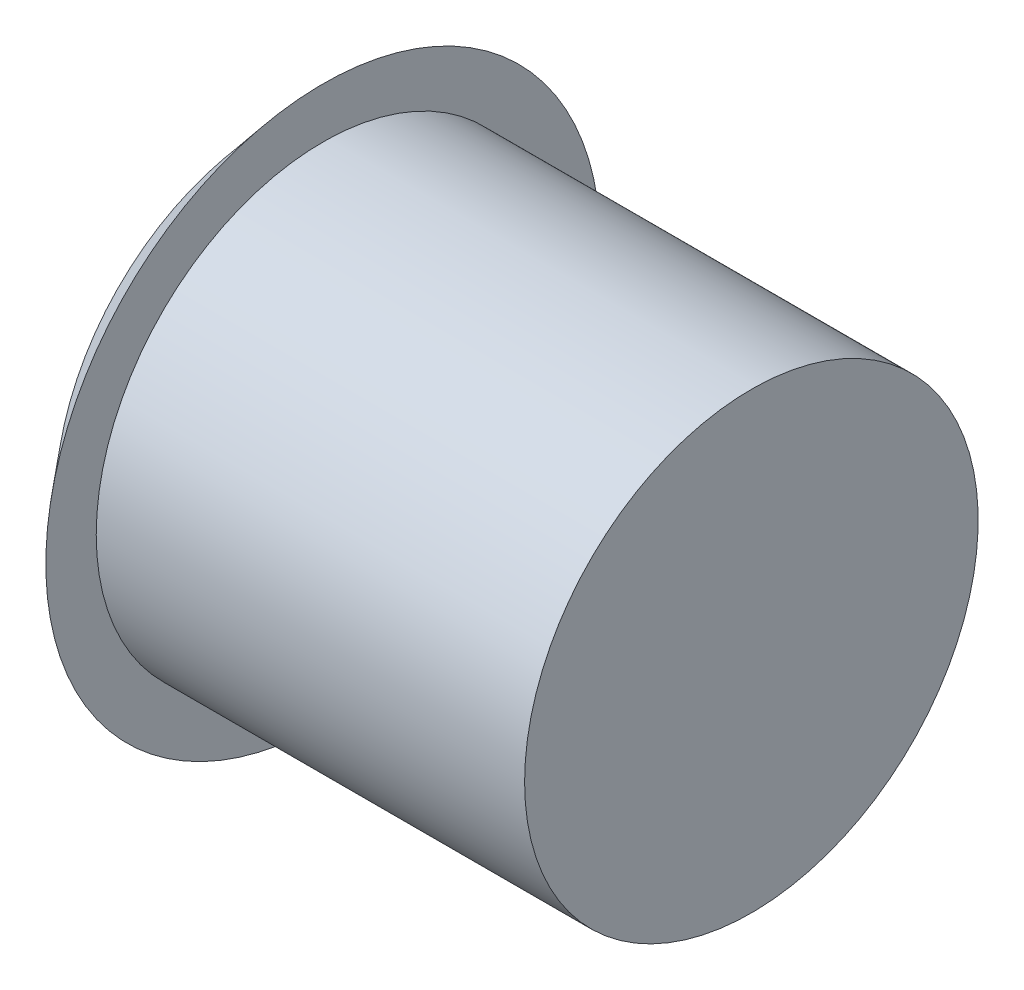
ISO-10303-21;
HEADER;
FILE_DESCRIPTION(('STEP AP214'),'2;1');
FILE_NAME('part.step','',(''),(''),'','','');
FILE_SCHEMA(('AUTOMOTIVE_DESIGN { 1 0 10303 214 1 1 1 1 }'));
ENDSEC;
DATA;
#1=APPLICATION_CONTEXT('core data for automotive mechanical design processes');
#2=APPLICATION_PROTOCOL_DEFINITION('international standard','automotive_design',2000,#1);
#3=PRODUCT_CONTEXT('',#1,'mechanical');
#4=PRODUCT('Part','Part','',(#3));
#5=PRODUCT_RELATED_PRODUCT_CATEGORY('part','',(#4));
#6=PRODUCT_DEFINITION_FORMATION('','',#4);
#7=PRODUCT_DEFINITION_CONTEXT('part definition',#1,'design');
#8=PRODUCT_DEFINITION('design','',#6,#7);
#9=PRODUCT_DEFINITION_SHAPE('','',#8);
#10=(LENGTH_UNIT() NAMED_UNIT(*) SI_UNIT(.MILLI.,.METRE.));
#11=(NAMED_UNIT(*) PLANE_ANGLE_UNIT() SI_UNIT($,.RADIAN.));
#12=(NAMED_UNIT(*) SI_UNIT($,.STERADIAN.) SOLID_ANGLE_UNIT());
#13=UNCERTAINTY_MEASURE_WITH_UNIT(LENGTH_MEASURE(1.E-05),#10,'distance_accuracy_value','');
#14=(GEOMETRIC_REPRESENTATION_CONTEXT(3) GLOBAL_UNCERTAINTY_ASSIGNED_CONTEXT((#13)) GLOBAL_UNIT_ASSIGNED_CONTEXT((#10,
#11,#12)) REPRESENTATION_CONTEXT('',''));
#15=CARTESIAN_POINT('',(0.,0.,0.));
#16=DIRECTION('',(0.,0.,1.));
#17=DIRECTION('',(1.,0.,0.));
#18=AXIS2_PLACEMENT_3D('',#15,#16,#17);
#19=CARTESIAN_POINT('',(-56.5,73.2881169884322,56.));
#20=DIRECTION('',(1.,0.,0.));
#21=DIRECTION('',(0.,0.,-1.));
#22=AXIS2_PLACEMENT_3D('',#19,#20,#21);
#23=CONICAL_SURFACE('',#22,11.,0.872664625997164);
#24=CARTESIAN_POINT('',(-58.5,73.2881169884322,56.));
#25=DIRECTION('',(1.,0.,0.));
#26=DIRECTION('',(0.,0.,-1.));
#27=AXIS2_PLACEMENT_3D('',#24,#25,#26);
#28=CIRCLE('',#27,8.61649281481158);
#29=CARTESIAN_POINT('',(-58.5,73.2881169884322,47.3835071851884));
#30=VERTEX_POINT('',#29);
#31=EDGE_CURVE('E10',#30,#30,#28,.T.);
#32=ORIENTED_EDGE('',*,*,#31,.T.);
#33=EDGE_LOOP('',(#32));
#34=FACE_BOUND('',#33,.T.);
#35=CARTESIAN_POINT('',(-56.5,73.2881169884322,56.));
#36=DIRECTION('',(1.,0.,0.));
#37=DIRECTION('',(0.,0.,-1.));
#38=AXIS2_PLACEMENT_3D('',#35,#36,#37);
#39=CIRCLE('',#38,11.);
#40=CARTESIAN_POINT('',(-56.5,73.2881169884322,45.));
#41=VERTEX_POINT('',#40);
#42=EDGE_CURVE('E22',#41,#41,#39,.T.);
#43=ORIENTED_EDGE('',*,*,#42,.F.);
#44=EDGE_LOOP('',(#43));
#45=FACE_BOUND('',#44,.T.);
#46=ADVANCED_FACE('F15',(#34,#45),#23,.T.);
#47=CARTESIAN_POINT('',(-58.5,73.2881169884322,56.));
#48=DIRECTION('',(1.,0.,0.));
#49=DIRECTION('',(0.,0.,-1.));
#50=AXIS2_PLACEMENT_3D('',#47,#48,#49);
#51=PLANE('',#50);
#52=ORIENTED_EDGE('',*,*,#31,.F.);
#53=EDGE_LOOP('',(#52));
#54=FACE_BOUND('',#53,.T.);
#55=ADVANCED_FACE('F59',(#54),#51,.F.);
#56=CARTESIAN_POINT('',(-56.5,73.2881169884322,56.));
#57=DIRECTION('',(1.,0.,0.));
#58=DIRECTION('',(0.,0.,-1.));
#59=AXIS2_PLACEMENT_3D('',#56,#57,#58);
#60=PLANE('',#59);
#61=CARTESIAN_POINT('',(-56.5,73.2881169884322,56.));
#62=DIRECTION('',(-1.,0.,0.));
#63=DIRECTION('',(0.,0.,1.));
#64=AXIS2_PLACEMENT_3D('',#61,#62,#63);
#65=CIRCLE('',#64,9.);
#66=CARTESIAN_POINT('',(-56.5,73.2881169884322,65.));
#67=VERTEX_POINT('',#66);
#68=EDGE_CURVE('E36',#67,#67,#65,.T.);
#69=ORIENTED_EDGE('',*,*,#68,.T.);
#70=EDGE_LOOP('',(#69));
#71=FACE_BOUND('',#70,.T.);
#72=ORIENTED_EDGE('',*,*,#42,.T.);
#73=EDGE_LOOP('',(#72));
#74=FACE_BOUND('',#73,.T.);
#75=ADVANCED_FACE('F45',(#71,#74),#60,.T.);
#76=CARTESIAN_POINT('',(-39.5,73.2881169884322,56.));
#77=DIRECTION('',(-1.,0.,0.));
#78=DIRECTION('',(0.,0.,1.));
#79=AXIS2_PLACEMENT_3D('',#76,#77,#78);
#80=CYLINDRICAL_SURFACE('',#79,9.);
#81=CARTESIAN_POINT('',(-39.5,73.2881169884322,56.));
#82=DIRECTION('',(-1.,0.,0.));
#83=DIRECTION('',(0.,0.,1.));
#84=AXIS2_PLACEMENT_3D('',#81,#82,#83);
#85=CIRCLE('',#84,9.);
#86=CARTESIAN_POINT('',(-39.5,73.2881169884322,65.));
#87=VERTEX_POINT('',#86);
#88=EDGE_CURVE('E29',#87,#87,#85,.T.);
#89=ORIENTED_EDGE('',*,*,#88,.T.);
#90=EDGE_LOOP('',(#89));
#91=FACE_BOUND('',#90,.T.);
#92=ORIENTED_EDGE('',*,*,#68,.F.);
#93=EDGE_LOOP('',(#92));
#94=FACE_BOUND('',#93,.T.);
#95=ADVANCED_FACE('F47',(#91,#94),#80,.T.);
#96=CARTESIAN_POINT('',(-39.5,73.2881169884322,56.));
#97=DIRECTION('',(-1.,0.,0.));
#98=DIRECTION('',(0.,0.,1.));
#99=AXIS2_PLACEMENT_3D('',#96,#97,#98);
#100=PLANE('',#99);
#101=ORIENTED_EDGE('',*,*,#88,.F.);
#102=EDGE_LOOP('',(#101));
#103=FACE_BOUND('',#102,.T.);
#104=ADVANCED_FACE('F49',(#103),#100,.F.);
#105=CLOSED_SHELL('',(#46,#55,#75,#95,#104));
#106=MANIFOLD_SOLID_BREP('B1',#105);
#107=ADVANCED_BREP_SHAPE_REPRESENTATION('',(#18,#106),#14);
#108=SHAPE_DEFINITION_REPRESENTATION(#9,#107);
ENDSEC;
END-ISO-10303-21;
